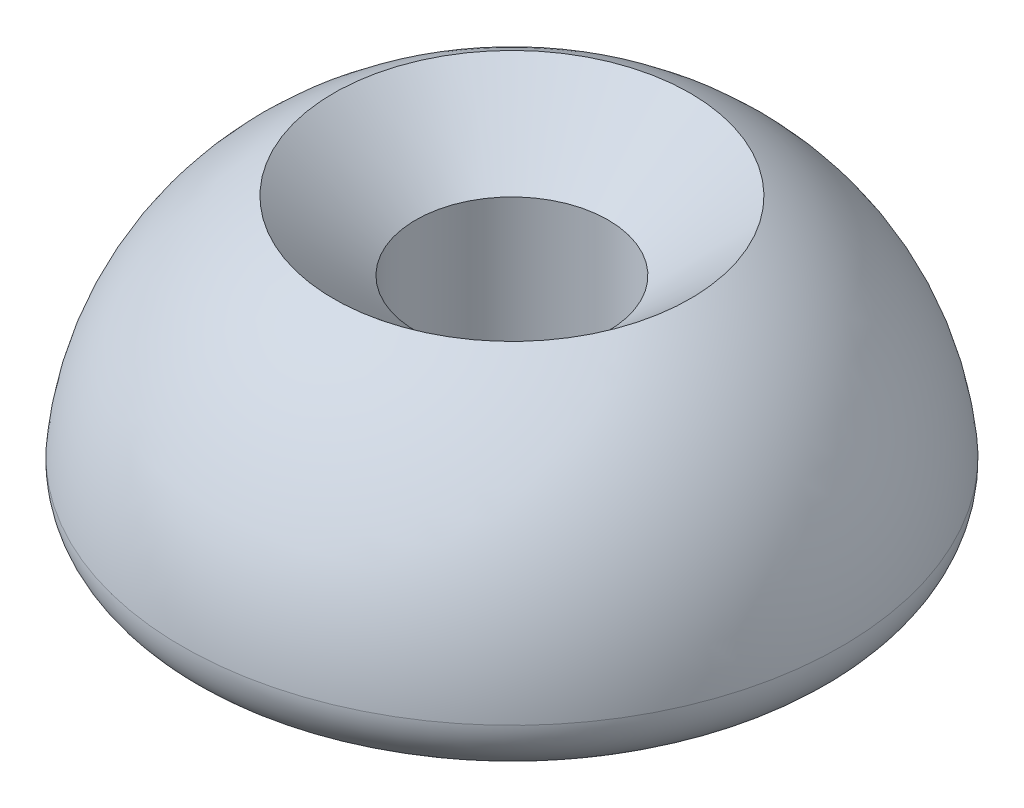
ISO-10303-21;
HEADER;
FILE_DESCRIPTION(('STEP AP214'),'2;1');
FILE_NAME('part.step','',(''),(''),'','','');
FILE_SCHEMA(('AUTOMOTIVE_DESIGN { 1 0 10303 214 1 1 1 1 }'));
ENDSEC;
DATA;
#1=APPLICATION_CONTEXT('core data for automotive mechanical design processes');
#2=APPLICATION_PROTOCOL_DEFINITION('international standard','automotive_design',2000,#1);
#3=PRODUCT_CONTEXT('',#1,'mechanical');
#4=PRODUCT('Part','Part','',(#3));
#5=PRODUCT_RELATED_PRODUCT_CATEGORY('part','',(#4));
#6=PRODUCT_DEFINITION_FORMATION('','',#4);
#7=PRODUCT_DEFINITION_CONTEXT('part definition',#1,'design');
#8=PRODUCT_DEFINITION('design','',#6,#7);
#9=PRODUCT_DEFINITION_SHAPE('','',#8);
#10=(LENGTH_UNIT() NAMED_UNIT(*) SI_UNIT(.MILLI.,.METRE.));
#11=(NAMED_UNIT(*) PLANE_ANGLE_UNIT() SI_UNIT($,.RADIAN.));
#12=(NAMED_UNIT(*) SI_UNIT($,.STERADIAN.) SOLID_ANGLE_UNIT());
#13=UNCERTAINTY_MEASURE_WITH_UNIT(LENGTH_MEASURE(1.E-05),#10,'distance_accuracy_value','');
#14=(GEOMETRIC_REPRESENTATION_CONTEXT(3) GLOBAL_UNCERTAINTY_ASSIGNED_CONTEXT((#13)) GLOBAL_UNIT_ASSIGNED_CONTEXT((#10,
#11,#12)) REPRESENTATION_CONTEXT('',''));
#15=CARTESIAN_POINT('',(0.,0.,0.));
#16=DIRECTION('',(0.,0.,1.));
#17=DIRECTION('',(1.,0.,0.));
#18=AXIS2_PLACEMENT_3D('',#15,#16,#17);
#19=CARTESIAN_POINT('',(0.,-84.7911764705882,0.));
#20=DIRECTION('',(0.,-1.,0.));
#21=DIRECTION('',(0.,0.,-1.));
#22=AXIS2_PLACEMENT_3D('',#19,#20,#21);
#23=CYLINDRICAL_SURFACE('',#22,17.);
#24=CARTESIAN_POINT('',(0.,-27.0377147804251,0.));
#25=DIRECTION('',(0.,-1.,0.));
#26=DIRECTION('',(0.,0.,-1.));
#27=AXIS2_PLACEMENT_3D('',#24,#25,#26);
#28=CIRCLE('',#27,17.);
#29=CARTESIAN_POINT('',(0.,-27.0377147804251,-17.));
#30=VERTEX_POINT('',#29);
#31=EDGE_CURVE('E62',#30,#30,#28,.T.);
#32=ORIENTED_EDGE('',*,*,#31,.F.);
#33=EDGE_LOOP('',(#32));
#34=FACE_BOUND('',#33,.T.);
#35=CARTESIAN_POINT('',(0.,-64.8707701283547,0.));
#36=DIRECTION('',(0.,-1.,0.));
#37=DIRECTION('',(0.,0.,-1.));
#38=AXIS2_PLACEMENT_3D('',#35,#36,#37);
#39=CIRCLE('',#38,17.);
#40=CARTESIAN_POINT('',(0.,-64.8707701283547,-17.));
#41=VERTEX_POINT('',#40);
#42=EDGE_CURVE('E10',#41,#41,#39,.T.);
#43=ORIENTED_EDGE('',*,*,#42,.T.);
#44=EDGE_LOOP('',(#43));
#45=FACE_BOUND('',#44,.T.);
#46=ADVANCED_FACE('F39',(#34,#45),#23,.F.);
#47=CARTESIAN_POINT('',(0.,-64.8707701283547,0.));
#48=DIRECTION('',(0.,-1.,0.));
#49=DIRECTION('',(0.,0.,-1.));
#50=AXIS2_PLACEMENT_3D('',#47,#48,#49);
#51=PLANE('',#50);
#52=CARTESIAN_POINT('',(0.,-64.8707701283547,0.));
#53=DIRECTION('',(0.,-1.,0.));
#54=DIRECTION('',(0.,0.,-1.));
#55=AXIS2_PLACEMENT_3D('',#52,#53,#54);
#56=CIRCLE('',#55,50.);
#57=CARTESIAN_POINT('',(0.,-64.8707701283547,-50.));
#58=VERTEX_POINT('',#57);
#59=EDGE_CURVE('E46',#58,#58,#56,.T.);
#60=ORIENTED_EDGE('',*,*,#59,.T.);
#61=EDGE_LOOP('',(#60));
#62=FACE_BOUND('',#61,.T.);
#63=ORIENTED_EDGE('',*,*,#42,.F.);
#64=EDGE_LOOP('',(#63));
#65=FACE_BOUND('',#64,.T.);
#66=ADVANCED_FACE('F70',(#62,#65),#51,.T.);
#67=CARTESIAN_POINT('',(0.,-55.0242436814919,0.));
#68=DIRECTION('',(0.,-1.,0.));
#69=DIRECTION('',(0.,0.,-1.));
#70=AXIS2_PLACEMENT_3D('',#67,#68,#69);
#71=TOROIDAL_SURFACE('',#70,48.2547444510242,10.);
#72=CARTESIAN_POINT('',(0.,-54.7162396057546,0.));
#73=DIRECTION('',(0.,-1.,0.));
#74=DIRECTION('',(0.,0.,-1.));
#75=AXIS2_PLACEMENT_3D('',#72,#73,#74);
#76=CIRCLE('',#75,58.25);
#77=CARTESIAN_POINT('',(0.,-54.7162396057546,-58.25));
#78=VERTEX_POINT('',#77);
#79=EDGE_CURVE('E51',#78,#78,#76,.T.);
#80=ORIENTED_EDGE('',*,*,#79,.T.);
#81=EDGE_LOOP('',(#80));
#82=FACE_BOUND('',#81,.T.);
#83=ORIENTED_EDGE('',*,*,#59,.F.);
#84=EDGE_LOOP('',(#83));
#85=FACE_BOUND('',#84,.T.);
#86=ADVANCED_FACE('F74',(#82,#85),#71,.T.);
#87=CARTESIAN_POINT('',(0.,-59.2435763602066,0.));
#88=DIRECTION('',(0.,-1.,0.));
#89=DIRECTION('',(0.,0.,-1.));
#90=AXIS2_PLACEMENT_3D('',#87,#88,#89);
#91=DEGENERATE_TOROIDAL_SURFACE('',#90,8.45538962988245,50.0000000000002,.T.);
#92=CARTESIAN_POINT('',(0.,-14.8707701283547,0.));
#93=DIRECTION('',(0.,-1.,0.));
#94=DIRECTION('',(0.,0.,-1.));
#95=AXIS2_PLACEMENT_3D('',#92,#93,#94);
#96=CIRCLE('',#95,31.5);
#97=CARTESIAN_POINT('',(0.,-14.8707701283547,-31.5));
#98=VERTEX_POINT('',#97);
#99=EDGE_CURVE('E56',#98,#98,#96,.T.);
#100=ORIENTED_EDGE('',*,*,#99,.T.);
#101=EDGE_LOOP('',(#100));
#102=FACE_BOUND('',#101,.T.);
#103=ORIENTED_EDGE('',*,*,#79,.F.);
#104=EDGE_LOOP('',(#103));
#105=FACE_BOUND('',#104,.T.);
#106=ADVANCED_FACE('F78',(#102,#105),#91,.T.);
#107=CARTESIAN_POINT('',(0.,-27.0377147804251,0.));
#108=DIRECTION('',(0.,1.,0.));
#109=DIRECTION('',(0.,0.,1.));
#110=AXIS2_PLACEMENT_3D('',#107,#108,#109);
#111=CONICAL_SURFACE('',#110,17.,0.87266462599717);
#112=ORIENTED_EDGE('',*,*,#99,.F.);
#113=EDGE_LOOP('',(#112));
#114=FACE_BOUND('',#113,.T.);
#115=ORIENTED_EDGE('',*,*,#31,.T.);
#116=EDGE_LOOP('',(#115));
#117=FACE_BOUND('',#116,.T.);
#118=ADVANCED_FACE('F67',(#114,#117),#111,.F.);
#119=CLOSED_SHELL('',(#46,#66,#86,#106,#118));
#120=MANIFOLD_SOLID_BREP('B2',#119);
#121=ADVANCED_BREP_SHAPE_REPRESENTATION('',(#18,#120),#14);
#122=SHAPE_DEFINITION_REPRESENTATION(#9,#121);
ENDSEC;
END-ISO-10303-21;
